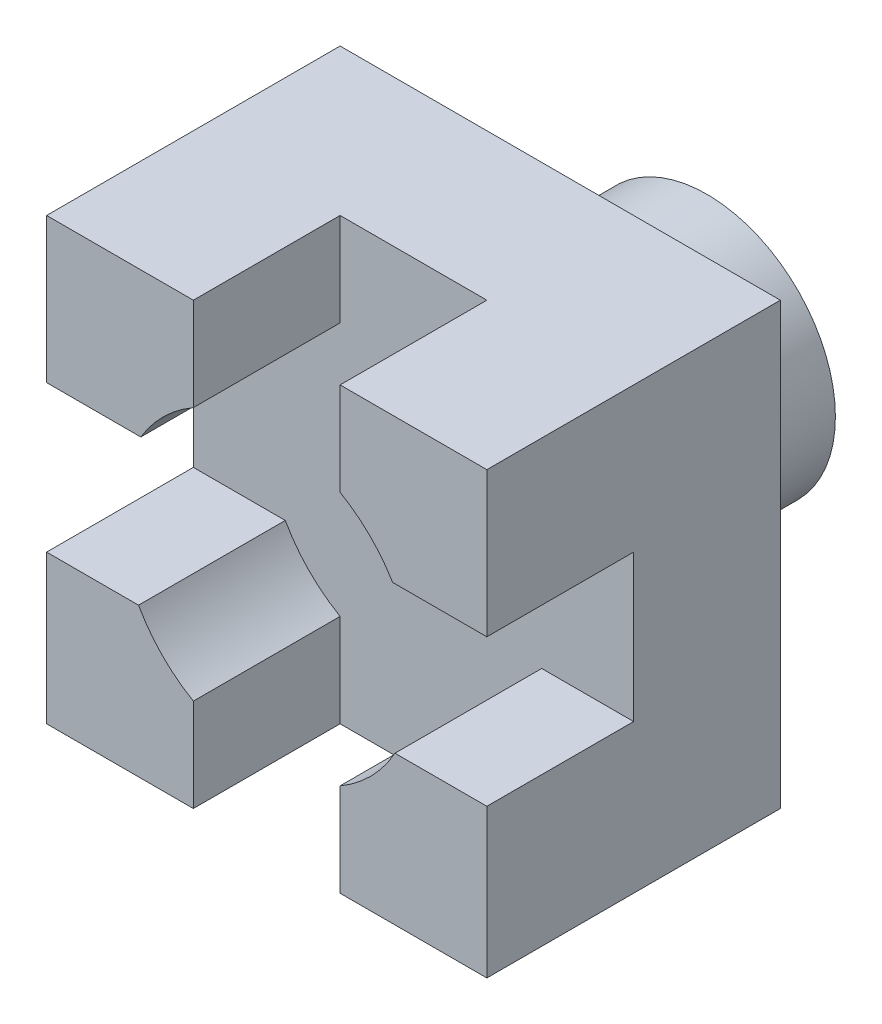
ISO-10303-21;
HEADER;
FILE_DESCRIPTION(('STEP AP214'),'2;1');
FILE_NAME('part.step','',(''),(''),'','','');
FILE_SCHEMA(('AUTOMOTIVE_DESIGN { 1 0 10303 214 1 1 1 1 }'));
ENDSEC;
DATA;
#1=APPLICATION_CONTEXT('core data for automotive mechanical design processes');
#2=APPLICATION_PROTOCOL_DEFINITION('international standard','automotive_design',2000,#1);
#3=PRODUCT_CONTEXT('',#1,'mechanical');
#4=PRODUCT('Part','Part','',(#3));
#5=PRODUCT_RELATED_PRODUCT_CATEGORY('part','',(#4));
#6=PRODUCT_DEFINITION_FORMATION('','',#4);
#7=PRODUCT_DEFINITION_CONTEXT('part definition',#1,'design');
#8=PRODUCT_DEFINITION('design','',#6,#7);
#9=PRODUCT_DEFINITION_SHAPE('','',#8);
#10=(LENGTH_UNIT() NAMED_UNIT(*) SI_UNIT(.MILLI.,.METRE.));
#11=(NAMED_UNIT(*) PLANE_ANGLE_UNIT() SI_UNIT($,.RADIAN.));
#12=(NAMED_UNIT(*) SI_UNIT($,.STERADIAN.) SOLID_ANGLE_UNIT());
#13=UNCERTAINTY_MEASURE_WITH_UNIT(LENGTH_MEASURE(1.E-05),#10,'distance_accuracy_value','');
#14=(GEOMETRIC_REPRESENTATION_CONTEXT(3) GLOBAL_UNCERTAINTY_ASSIGNED_CONTEXT((#13)) GLOBAL_UNIT_ASSIGNED_CONTEXT((#10,
#11,#12)) REPRESENTATION_CONTEXT('',''));
#15=CARTESIAN_POINT('',(0.,0.,0.));
#16=DIRECTION('',(0.,0.,1.));
#17=DIRECTION('',(1.,0.,0.));
#18=AXIS2_PLACEMENT_3D('',#15,#16,#17);
#19=CARTESIAN_POINT('',(-36.9678975337373,27.7914081400304,6.));
#20=DIRECTION('',(-1.,0.,0.));
#21=DIRECTION('',(0.,0.,1.));
#22=AXIS2_PLACEMENT_3D('',#19,#20,#21);
#23=PLANE('',#22);
#24=DIRECTION('',(0.,0.,1.));
#25=VECTOR('',#24,1.);
#26=CARTESIAN_POINT('',(-36.9678975337373,25.8182404913917,4.));
#27=LINE('',#26,#25);
#28=CARTESIAN_POINT('',(-36.9678975337373,25.8182404913917,4.));
#29=VERTEX_POINT('',#28);
#30=CARTESIAN_POINT('',(-36.9678975337373,25.8182404913917,6.));
#31=VERTEX_POINT('',#30);
#32=EDGE_CURVE('E287',#29,#31,#27,.T.);
#33=ORIENTED_EDGE('',*,*,#32,.F.);
#34=DIRECTION('',(0.,1.,0.));
#35=VECTOR('',#34,1.);
#36=CARTESIAN_POINT('',(-36.9678975337373,0.,4.));
#37=LINE('',#36,#35);
#38=CARTESIAN_POINT('',(-36.9678975337373,23.8182404913919,4.));
#39=VERTEX_POINT('',#38);
#40=EDGE_CURVE('E217',#39,#29,#37,.T.);
#41=ORIENTED_EDGE('',*,*,#40,.F.);
#42=DIRECTION('',(0.,0.,1.));
#43=VECTOR('',#42,1.);
#44=CARTESIAN_POINT('',(-36.9678975337373,23.8182404913919,4.));
#45=LINE('',#44,#43);
#46=CARTESIAN_POINT('',(-36.9678975337373,23.8182404913919,6.));
#47=VERTEX_POINT('',#46);
#48=EDGE_CURVE('E289',#39,#47,#45,.T.);
#49=ORIENTED_EDGE('',*,*,#48,.T.);
#50=DIRECTION('',(0.,1.,0.));
#51=VECTOR('',#50,1.);
#52=CARTESIAN_POINT('',(-36.9678975337373,27.7914081400304,6.));
#53=LINE('',#52,#51);
#54=CARTESIAN_POINT('',(-36.9678975337373,21.7914081400304,6.));
#55=VERTEX_POINT('',#54);
#56=EDGE_CURVE('E299',#55,#47,#53,.T.);
#57=ORIENTED_EDGE('',*,*,#56,.F.);
#58=DIRECTION('',(0.,0.,-1.));
#59=VECTOR('',#58,1.);
#60=CARTESIAN_POINT('',(-36.9678975337373,21.7914081400304,6.));
#61=LINE('',#60,#59);
#62=CARTESIAN_POINT('',(-36.9678975337373,21.7914081400304,2.));
#63=VERTEX_POINT('',#62);
#64=EDGE_CURVE('E311',#55,#63,#61,.T.);
#65=ORIENTED_EDGE('',*,*,#64,.T.);
#66=DIRECTION('',(0.,1.,0.));
#67=VECTOR('',#66,1.);
#68=CARTESIAN_POINT('',(-36.9678975337373,27.7914081400304,2.));
#69=LINE('',#68,#67);
#70=CARTESIAN_POINT('',(-36.9678975337373,27.7914081400304,2.));
#71=VERTEX_POINT('',#70);
#72=EDGE_CURVE('E268',#63,#71,#69,.T.);
#73=ORIENTED_EDGE('',*,*,#72,.T.);
#74=DIRECTION('',(0.,0.,-1.));
#75=VECTOR('',#74,1.);
#76=CARTESIAN_POINT('',(-36.9678975337373,27.7914081400304,6.));
#77=LINE('',#76,#75);
#78=CARTESIAN_POINT('',(-36.9678975337373,27.7914081400304,6.));
#79=VERTEX_POINT('',#78);
#80=EDGE_CURVE('E325',#79,#71,#77,.T.);
#81=ORIENTED_EDGE('',*,*,#80,.F.);
#82=EDGE_CURVE('E86',#31,#79,#53,.T.);
#83=ORIENTED_EDGE('',*,*,#82,.F.);
#84=EDGE_LOOP('',(#33,#41,#49,#57,#65,#73,#81,#83));
#85=FACE_BOUND('',#84,.T.);
#86=ADVANCED_FACE('F32',(#85),#23,.F.);
#87=CARTESIAN_POINT('',(-42.9678975337373,27.7914081400304,6.));
#88=DIRECTION('',(0.,-1.,0.));
#89=DIRECTION('',(0.,0.,-1.));
#90=AXIS2_PLACEMENT_3D('',#87,#88,#89);
#91=PLANE('',#90);
#92=DIRECTION('',(0.,0.,1.));
#93=VECTOR('',#92,1.);
#94=CARTESIAN_POINT('',(-40.9678975337373,27.7914081400304,4.));
#95=LINE('',#94,#93);
#96=CARTESIAN_POINT('',(-40.9678975337373,27.7914081400304,4.));
#97=VERTEX_POINT('',#96);
#98=CARTESIAN_POINT('',(-40.9678975337373,27.7914081400304,6.));
#99=VERTEX_POINT('',#98);
#100=EDGE_CURVE('E278',#97,#99,#95,.T.);
#101=ORIENTED_EDGE('',*,*,#100,.F.);
#102=DIRECTION('',(-1.,0.,0.));
#103=VECTOR('',#102,1.);
#104=CARTESIAN_POINT('',(0.,27.7914081400304,4.));
#105=LINE('',#104,#103);
#106=CARTESIAN_POINT('',(-38.9678975337373,27.7914081400304,4.));
#107=VERTEX_POINT('',#106);
#108=EDGE_CURVE('E228',#107,#97,#105,.T.);
#109=ORIENTED_EDGE('',*,*,#108,.F.);
#110=DIRECTION('',(0.,0.,1.));
#111=VECTOR('',#110,1.);
#112=CARTESIAN_POINT('',(-38.9678975337373,27.7914081400304,4.));
#113=LINE('',#112,#111);
#114=CARTESIAN_POINT('',(-38.9678975337373,27.7914081400304,6.));
#115=VERTEX_POINT('',#114);
#116=EDGE_CURVE('E280',#107,#115,#113,.T.);
#117=ORIENTED_EDGE('',*,*,#116,.T.);
#118=DIRECTION('',(-1.,0.,0.));
#119=VECTOR('',#118,1.);
#120=CARTESIAN_POINT('',(-42.9678975337373,27.7914081400304,6.));
#121=LINE('',#120,#119);
#122=EDGE_CURVE('E302',#79,#115,#121,.T.);
#123=ORIENTED_EDGE('',*,*,#122,.F.);
#124=ORIENTED_EDGE('',*,*,#80,.T.);
#125=DIRECTION('',(-1.,0.,0.));
#126=VECTOR('',#125,1.);
#127=CARTESIAN_POINT('',(-42.9678975337373,27.7914081400304,2.));
#128=LINE('',#127,#126);
#129=CARTESIAN_POINT('',(-42.9678975337373,27.7914081400304,2.));
#130=VERTEX_POINT('',#129);
#131=EDGE_CURVE('E314',#71,#130,#128,.T.);
#132=ORIENTED_EDGE('',*,*,#131,.T.);
#133=DIRECTION('',(0.,0.,-1.));
#134=VECTOR('',#133,1.);
#135=CARTESIAN_POINT('',(-42.9678975337373,27.7914081400304,6.));
#136=LINE('',#135,#134);
#137=CARTESIAN_POINT('',(-42.9678975337373,27.7914081400304,6.));
#138=VERTEX_POINT('',#137);
#139=EDGE_CURVE('E322',#138,#130,#136,.T.);
#140=ORIENTED_EDGE('',*,*,#139,.F.);
#141=EDGE_CURVE('E301',#99,#138,#121,.T.);
#142=ORIENTED_EDGE('',*,*,#141,.F.);
#143=EDGE_LOOP('',(#101,#109,#117,#123,#124,#132,#140,#142));
#144=FACE_BOUND('',#143,.T.);
#145=ADVANCED_FACE('F354',(#144),#91,.F.);
#146=CARTESIAN_POINT('',(-42.9678975337373,27.7914081400304,6.));
#147=DIRECTION('',(1.,0.,0.));
#148=DIRECTION('',(0.,0.,-1.));
#149=AXIS2_PLACEMENT_3D('',#146,#147,#148);
#150=PLANE('',#149);
#151=DIRECTION('',(0.,0.,1.));
#152=VECTOR('',#151,1.);
#153=CARTESIAN_POINT('',(-42.9678975337373,23.8182404913919,4.));
#154=LINE('',#153,#152);
#155=CARTESIAN_POINT('',(-42.9678975337373,23.8182404913919,4.));
#156=VERTEX_POINT('',#155);
#157=CARTESIAN_POINT('',(-42.9678975337373,23.8182404913919,6.));
#158=VERTEX_POINT('',#157);
#159=EDGE_CURVE('E269',#156,#158,#154,.T.);
#160=ORIENTED_EDGE('',*,*,#159,.F.);
#161=DIRECTION('',(0.,-1.,0.));
#162=VECTOR('',#161,1.);
#163=CARTESIAN_POINT('',(-42.9678975337373,0.,4.));
#164=LINE('',#163,#162);
#165=CARTESIAN_POINT('',(-42.9678975337373,25.8182404913917,4.));
#166=VERTEX_POINT('',#165);
#167=EDGE_CURVE('E238',#166,#156,#164,.T.);
#168=ORIENTED_EDGE('',*,*,#167,.F.);
#169=DIRECTION('',(0.,0.,1.));
#170=VECTOR('',#169,1.);
#171=CARTESIAN_POINT('',(-42.9678975337373,25.8182404913917,4.));
#172=LINE('',#171,#170);
#173=CARTESIAN_POINT('',(-42.9678975337373,25.8182404913917,6.));
#174=VERTEX_POINT('',#173);
#175=EDGE_CURVE('E271',#166,#174,#172,.T.);
#176=ORIENTED_EDGE('',*,*,#175,.T.);
#177=DIRECTION('',(0.,-1.,0.));
#178=VECTOR('',#177,1.);
#179=CARTESIAN_POINT('',(-42.9678975337373,27.7914081400304,6.));
#180=LINE('',#179,#178);
#181=EDGE_CURVE('E305',#138,#174,#180,.T.);
#182=ORIENTED_EDGE('',*,*,#181,.F.);
#183=ORIENTED_EDGE('',*,*,#139,.T.);
#184=DIRECTION('',(0.,-1.,0.));
#185=VECTOR('',#184,1.);
#186=CARTESIAN_POINT('',(-42.9678975337373,27.7914081400304,2.));
#187=LINE('',#186,#185);
#188=CARTESIAN_POINT('',(-42.9678975337373,21.7914081400304,2.));
#189=VERTEX_POINT('',#188);
#190=EDGE_CURVE('E316',#130,#189,#187,.T.);
#191=ORIENTED_EDGE('',*,*,#190,.T.);
#192=DIRECTION('',(0.,0.,-1.));
#193=VECTOR('',#192,1.);
#194=CARTESIAN_POINT('',(-42.9678975337373,21.7914081400304,6.));
#195=LINE('',#194,#193);
#196=CARTESIAN_POINT('',(-42.9678975337373,21.7914081400304,6.));
#197=VERTEX_POINT('',#196);
#198=EDGE_CURVE('E320',#197,#189,#195,.T.);
#199=ORIENTED_EDGE('',*,*,#198,.F.);
#200=EDGE_CURVE('E304',#158,#197,#180,.T.);
#201=ORIENTED_EDGE('',*,*,#200,.F.);
#202=EDGE_LOOP('',(#160,#168,#176,#182,#183,#191,#199,#201));
#203=FACE_BOUND('',#202,.T.);
#204=ADVANCED_FACE('F360',(#203),#150,.F.);
#205=CARTESIAN_POINT('',(-42.9678975337373,21.7914081400304,6.));
#206=DIRECTION('',(0.,1.,0.));
#207=DIRECTION('',(0.,0.,1.));
#208=AXIS2_PLACEMENT_3D('',#205,#206,#207);
#209=PLANE('',#208);
#210=DIRECTION('',(0.,0.,1.));
#211=VECTOR('',#210,1.);
#212=CARTESIAN_POINT('',(-38.9678975337373,21.7914081400304,4.));
#213=LINE('',#212,#211);
#214=CARTESIAN_POINT('',(-38.9678975337373,21.7914081400304,4.));
#215=VERTEX_POINT('',#214);
#216=CARTESIAN_POINT('',(-38.9678975337373,21.7914081400304,6.));
#217=VERTEX_POINT('',#216);
#218=EDGE_CURVE('E296',#215,#217,#213,.T.);
#219=ORIENTED_EDGE('',*,*,#218,.F.);
#220=DIRECTION('',(1.,0.,0.));
#221=VECTOR('',#220,1.);
#222=CARTESIAN_POINT('',(0.,21.7914081400304,4.));
#223=LINE('',#222,#221);
#224=CARTESIAN_POINT('',(-40.9678975337373,21.7914081400304,4.));
#225=VERTEX_POINT('',#224);
#226=EDGE_CURVE('E192',#225,#215,#223,.T.);
#227=ORIENTED_EDGE('',*,*,#226,.F.);
#228=DIRECTION('',(0.,0.,1.));
#229=VECTOR('',#228,1.);
#230=CARTESIAN_POINT('',(-40.9678975337373,21.7914081400304,4.));
#231=LINE('',#230,#229);
#232=CARTESIAN_POINT('',(-40.9678975337373,21.7914081400304,6.));
#233=VERTEX_POINT('',#232);
#234=EDGE_CURVE('E187',#225,#233,#231,.T.);
#235=ORIENTED_EDGE('',*,*,#234,.T.);
#236=DIRECTION('',(1.,0.,0.));
#237=VECTOR('',#236,1.);
#238=CARTESIAN_POINT('',(-42.9678975337373,21.7914081400304,6.));
#239=LINE('',#238,#237);
#240=EDGE_CURVE('E308',#197,#233,#239,.T.);
#241=ORIENTED_EDGE('',*,*,#240,.F.);
#242=ORIENTED_EDGE('',*,*,#198,.T.);
#243=DIRECTION('',(1.,0.,0.));
#244=VECTOR('',#243,1.);
#245=CARTESIAN_POINT('',(-42.9678975337373,21.7914081400304,2.));
#246=LINE('',#245,#244);
#247=EDGE_CURVE('E78',#189,#63,#246,.T.);
#248=ORIENTED_EDGE('',*,*,#247,.T.);
#249=ORIENTED_EDGE('',*,*,#64,.F.);
#250=EDGE_CURVE('E56',#217,#55,#239,.T.);
#251=ORIENTED_EDGE('',*,*,#250,.F.);
#252=EDGE_LOOP('',(#219,#227,#235,#241,#242,#248,#249,#251));
#253=FACE_BOUND('',#252,.T.);
#254=ADVANCED_FACE('F395',(#253),#209,.F.);
#255=CARTESIAN_POINT('',(0.,0.,6.));
#256=DIRECTION('',(0.,0.,1.));
#257=DIRECTION('',(1.,0.,0.));
#258=AXIS2_PLACEMENT_3D('',#255,#256,#257);
#259=PLANE('',#258);
#260=ORIENTED_EDGE('',*,*,#181,.T.);
#261=DIRECTION('',(1.,0.,0.));
#262=VECTOR('',#261,1.);
#263=CARTESIAN_POINT('',(0.,25.8182404913917,6.));
#264=LINE('',#263,#262);
#265=CARTESIAN_POINT('',(-41.6841770337599,25.8182404913917,6.));
#266=VERTEX_POINT('',#265);
#267=EDGE_CURVE('E205',#174,#266,#264,.T.);
#268=ORIENTED_EDGE('',*,*,#267,.T.);
#269=CARTESIAN_POINT('',(-39.9678975337373,24.7914081400304,6.));
#270=DIRECTION('',(0.,0.,1.));
#271=DIRECTION('',(1.,0.,0.));
#272=AXIS2_PLACEMENT_3D('',#269,#270,#271);
#273=CIRCLE('',#272,2.);
#274=CARTESIAN_POINT('',(-40.9678975337373,26.5234589475993,6.));
#275=VERTEX_POINT('',#274);
#276=EDGE_CURVE('E261',#275,#266,#273,.T.);
#277=ORIENTED_EDGE('',*,*,#276,.F.);
#278=DIRECTION('',(0.,1.,0.));
#279=VECTOR('',#278,1.);
#280=CARTESIAN_POINT('',(-40.9678975337373,0.,6.));
#281=LINE('',#280,#279);
#282=EDGE_CURVE('E258',#275,#99,#281,.T.);
#283=ORIENTED_EDGE('',*,*,#282,.T.);
#284=ORIENTED_EDGE('',*,*,#141,.T.);
#285=EDGE_LOOP('',(#260,#268,#277,#283,#284));
#286=FACE_BOUND('',#285,.T.);
#287=ADVANCED_FACE('F379',(#286),#259,.T.);
#288=DIRECTION('',(0.,1.,0.));
#289=VECTOR('',#288,1.);
#290=CARTESIAN_POINT('',(-38.9678975337373,0.,6.));
#291=LINE('',#290,#289);
#292=CARTESIAN_POINT('',(-38.9678975337373,26.5234589475993,6.));
#293=VERTEX_POINT('',#292);
#294=EDGE_CURVE('E256',#293,#115,#291,.T.);
#295=ORIENTED_EDGE('',*,*,#294,.F.);
#296=CARTESIAN_POINT('',(-39.9678975337373,24.7914081400304,6.));
#297=DIRECTION('',(0.,0.,1.));
#298=DIRECTION('',(1.,0.,0.));
#299=AXIS2_PLACEMENT_3D('',#296,#297,#298);
#300=CIRCLE('',#299,2.);
#301=CARTESIAN_POINT('',(-38.2516180337147,25.8182404913917,6.));
#302=VERTEX_POINT('',#301);
#303=EDGE_CURVE('E253',#302,#293,#300,.T.);
#304=ORIENTED_EDGE('',*,*,#303,.F.);
#305=DIRECTION('',(1.,0.,0.));
#306=VECTOR('',#305,1.);
#307=CARTESIAN_POINT('',(0.,25.8182404913917,6.));
#308=LINE('',#307,#306);
#309=EDGE_CURVE('E251',#302,#31,#308,.T.);
#310=ORIENTED_EDGE('',*,*,#309,.T.);
#311=ORIENTED_EDGE('',*,*,#82,.T.);
#312=ORIENTED_EDGE('',*,*,#122,.T.);
#313=EDGE_LOOP('',(#295,#304,#310,#311,#312));
#314=FACE_BOUND('',#313,.T.);
#315=ADVANCED_FACE('F348',(#314),#259,.T.);
#316=CARTESIAN_POINT('',(-39.9678975337373,24.7914081400304,6.));
#317=DIRECTION('',(0.,0.,1.));
#318=DIRECTION('',(1.,0.,0.));
#319=AXIS2_PLACEMENT_3D('',#316,#317,#318);
#320=CIRCLE('',#319,2.);
#321=CARTESIAN_POINT('',(-41.7151653230711,23.8182404913919,6.));
#322=VERTEX_POINT('',#321);
#323=CARTESIAN_POINT('',(-40.9678975337373,23.0593573324616,6.));
#324=VERTEX_POINT('',#323);
#325=EDGE_CURVE('E47',#322,#324,#320,.T.);
#326=ORIENTED_EDGE('',*,*,#325,.F.);
#327=DIRECTION('',(-1.,0.,0.));
#328=VECTOR('',#327,1.);
#329=CARTESIAN_POINT('',(0.,23.8182404913919,6.));
#330=LINE('',#329,#328);
#331=EDGE_CURVE('E202',#322,#158,#330,.T.);
#332=ORIENTED_EDGE('',*,*,#331,.T.);
#333=ORIENTED_EDGE('',*,*,#200,.T.);
#334=ORIENTED_EDGE('',*,*,#240,.T.);
#335=DIRECTION('',(0.,1.,0.));
#336=VECTOR('',#335,1.);
#337=CARTESIAN_POINT('',(-40.9678975337373,0.,6.));
#338=LINE('',#337,#336);
#339=EDGE_CURVE('E242',#233,#324,#338,.T.);
#340=ORIENTED_EDGE('',*,*,#339,.T.);
#341=EDGE_LOOP('',(#326,#332,#333,#334,#340));
#342=FACE_BOUND('',#341,.T.);
#343=ADVANCED_FACE('F341',(#342),#259,.T.);
#344=CARTESIAN_POINT('',(-39.9678975337373,24.7914081400304,0.));
#345=DIRECTION('',(0.,0.,1.));
#346=DIRECTION('',(1.,0.,0.));
#347=AXIS2_PLACEMENT_3D('',#344,#345,#346);
#348=PLANE('',#347);
#349=CARTESIAN_POINT('',(-39.9678975337373,24.7914081400304,0.));
#350=DIRECTION('',(0.,0.,1.));
#351=DIRECTION('',(1.,0.,0.));
#352=AXIS2_PLACEMENT_3D('',#349,#350,#351);
#353=CIRCLE('',#352,1.75);
#354=CARTESIAN_POINT('',(-38.2178975337373,24.7914081400304,0.));
#355=VERTEX_POINT('',#354);
#356=EDGE_CURVE('E36',#355,#355,#353,.T.);
#357=ORIENTED_EDGE('',*,*,#356,.F.);
#358=EDGE_LOOP('',(#357));
#359=FACE_BOUND('',#358,.T.);
#360=CARTESIAN_POINT('',(-39.9678975337373,24.7914081400304,0.));
#361=DIRECTION('',(0.,0.,1.));
#362=DIRECTION('',(1.,0.,0.));
#363=AXIS2_PLACEMENT_3D('',#360,#361,#362);
#364=CIRCLE('',#363,0.999999999999998);
#365=CARTESIAN_POINT('',(-38.9678975337373,24.7914081400304,0.));
#366=VERTEX_POINT('',#365);
#367=EDGE_CURVE('E331',#366,#366,#364,.T.);
#368=ORIENTED_EDGE('',*,*,#367,.T.);
#369=EDGE_LOOP('',(#368));
#370=FACE_BOUND('',#369,.T.);
#371=ADVANCED_FACE('F339',(#359,#370),#348,.F.);
#372=CARTESIAN_POINT('',(-39.9678975337373,24.7914081400304,2.));
#373=DIRECTION('',(0.,0.,-1.));
#374=DIRECTION('',(-1.,0.,0.));
#375=AXIS2_PLACEMENT_3D('',#372,#373,#374);
#376=CYLINDRICAL_SURFACE('',#375,1.75);
#377=CARTESIAN_POINT('',(-39.9678975337373,24.7914081400304,2.));
#378=DIRECTION('',(0.,0.,1.));
#379=DIRECTION('',(1.,0.,0.));
#380=AXIS2_PLACEMENT_3D('',#377,#378,#379);
#381=CIRCLE('',#380,1.75);
#382=CARTESIAN_POINT('',(-38.2178975337373,24.7914081400304,2.));
#383=VERTEX_POINT('',#382);
#384=EDGE_CURVE('E11',#383,#383,#381,.T.);
#385=ORIENTED_EDGE('',*,*,#384,.F.);
#386=EDGE_LOOP('',(#385));
#387=FACE_BOUND('',#386,.T.);
#388=ORIENTED_EDGE('',*,*,#356,.T.);
#389=EDGE_LOOP('',(#388));
#390=FACE_BOUND('',#389,.T.);
#391=ADVANCED_FACE('F34',(#387,#390),#376,.T.);
#392=CARTESIAN_POINT('',(-39.9678975337373,24.7914081400304,2.));
#393=DIRECTION('',(0.,0.,-1.));
#394=DIRECTION('',(-1.,0.,0.));
#395=AXIS2_PLACEMENT_3D('',#392,#393,#394);
#396=CYLINDRICAL_SURFACE('',#395,0.999999999999998);
#397=CARTESIAN_POINT('',(-39.9678975337373,24.7914081400304,2.));
#398=DIRECTION('',(0.,0.,1.));
#399=DIRECTION('',(1.,0.,0.));
#400=AXIS2_PLACEMENT_3D('',#397,#398,#399);
#401=CIRCLE('',#400,0.999999999999998);
#402=CARTESIAN_POINT('',(-38.9678975337373,24.7914081400304,2.));
#403=VERTEX_POINT('',#402);
#404=EDGE_CURVE('E328',#403,#403,#401,.T.);
#405=ORIENTED_EDGE('',*,*,#404,.T.);
#406=EDGE_LOOP('',(#405));
#407=FACE_BOUND('',#406,.T.);
#408=ORIENTED_EDGE('',*,*,#367,.F.);
#409=EDGE_LOOP('',(#408));
#410=FACE_BOUND('',#409,.T.);
#411=ADVANCED_FACE('F346',(#407,#410),#396,.F.);
#412=CARTESIAN_POINT('',(0.,0.,2.));
#413=DIRECTION('',(0.,0.,1.));
#414=DIRECTION('',(1.,0.,0.));
#415=AXIS2_PLACEMENT_3D('',#412,#413,#414);
#416=PLANE('',#415);
#417=ORIENTED_EDGE('',*,*,#404,.F.);
#418=EDGE_LOOP('',(#417));
#419=FACE_BOUND('',#418,.T.);
#420=ADVANCED_FACE('F366',(#419),#416,.F.);
#421=DIRECTION('',(1.,0.,0.));
#422=VECTOR('',#421,1.);
#423=CARTESIAN_POINT('',(0.,23.8182404913919,6.));
#424=LINE('',#423,#422);
#425=CARTESIAN_POINT('',(-38.2206297444035,23.8182404913919,6.));
#426=VERTEX_POINT('',#425);
#427=EDGE_CURVE('E249',#426,#47,#424,.T.);
#428=ORIENTED_EDGE('',*,*,#427,.F.);
#429=CARTESIAN_POINT('',(-39.9678975337373,24.7914081400304,6.));
#430=DIRECTION('',(0.,0.,1.));
#431=DIRECTION('',(1.,0.,0.));
#432=AXIS2_PLACEMENT_3D('',#429,#430,#431);
#433=CIRCLE('',#432,2.);
#434=CARTESIAN_POINT('',(-38.9678975337373,23.0593573324616,6.));
#435=VERTEX_POINT('',#434);
#436=EDGE_CURVE('E246',#435,#426,#433,.T.);
#437=ORIENTED_EDGE('',*,*,#436,.F.);
#438=DIRECTION('',(0.,-1.,0.));
#439=VECTOR('',#438,1.);
#440=CARTESIAN_POINT('',(-38.9678975337373,0.,6.));
#441=LINE('',#440,#439);
#442=EDGE_CURVE('E244',#435,#217,#441,.T.);
#443=ORIENTED_EDGE('',*,*,#442,.T.);
#444=ORIENTED_EDGE('',*,*,#250,.T.);
#445=ORIENTED_EDGE('',*,*,#56,.T.);
#446=EDGE_LOOP('',(#428,#437,#443,#444,#445));
#447=FACE_BOUND('',#446,.T.);
#448=ADVANCED_FACE('F351',(#447),#259,.T.);
#449=ORIENTED_EDGE('',*,*,#384,.T.);
#450=EDGE_LOOP('',(#449));
#451=FACE_BOUND('',#450,.T.);
#452=ORIENTED_EDGE('',*,*,#72,.F.);
#453=ORIENTED_EDGE('',*,*,#247,.F.);
#454=ORIENTED_EDGE('',*,*,#190,.F.);
#455=ORIENTED_EDGE('',*,*,#131,.F.);
#456=EDGE_LOOP('',(#452,#453,#454,#455));
#457=FACE_BOUND('',#456,.T.);
#458=ADVANCED_FACE('F373',(#451,#457),#416,.F.);
#459=CARTESIAN_POINT('',(-39.9678975337373,24.7914081400304,4.));
#460=DIRECTION('',(0.,0.,1.));
#461=DIRECTION('',(1.,0.,0.));
#462=AXIS2_PLACEMENT_3D('',#459,#460,#461);
#463=CYLINDRICAL_SURFACE('',#462,2.);
#464=ORIENTED_EDGE('',*,*,#325,.T.);
#465=DIRECTION('',(0.,0.,1.));
#466=VECTOR('',#465,1.);
#467=CARTESIAN_POINT('',(-40.9678975337373,23.0593573324616,4.));
#468=LINE('',#467,#466);
#469=CARTESIAN_POINT('',(-40.9678975337373,23.0593573324616,4.));
#470=VERTEX_POINT('',#469);
#471=EDGE_CURVE('E184',#470,#324,#468,.T.);
#472=ORIENTED_EDGE('',*,*,#471,.F.);
#473=CARTESIAN_POINT('',(-39.9678975337373,24.7914081400304,4.));
#474=DIRECTION('',(0.,0.,1.));
#475=DIRECTION('',(1.,0.,0.));
#476=AXIS2_PLACEMENT_3D('',#473,#474,#475);
#477=CIRCLE('',#476,2.);
#478=CARTESIAN_POINT('',(-41.7151653230711,23.8182404913919,4.));
#479=VERTEX_POINT('',#478);
#480=EDGE_CURVE('E193',#479,#470,#477,.T.);
#481=ORIENTED_EDGE('',*,*,#480,.F.);
#482=DIRECTION('',(0.,0.,1.));
#483=VECTOR('',#482,1.);
#484=CARTESIAN_POINT('',(-41.7151653230711,23.8182404913919,4.));
#485=LINE('',#484,#483);
#486=EDGE_CURVE('E266',#479,#322,#485,.T.);
#487=ORIENTED_EDGE('',*,*,#486,.T.);
#488=EDGE_LOOP('',(#464,#472,#481,#487));
#489=FACE_BOUND('',#488,.T.);
#490=ADVANCED_FACE('F196',(#489),#463,.F.);
#491=CARTESIAN_POINT('',(0.,23.8182404913919,4.));
#492=DIRECTION('',(0.,1.,0.));
#493=DIRECTION('',(0.,0.,1.));
#494=AXIS2_PLACEMENT_3D('',#491,#492,#493);
#495=PLANE('',#494);
#496=ORIENTED_EDGE('',*,*,#331,.F.);
#497=ORIENTED_EDGE('',*,*,#486,.F.);
#498=DIRECTION('',(-1.,0.,0.));
#499=VECTOR('',#498,1.);
#500=CARTESIAN_POINT('',(0.,23.8182404913919,4.));
#501=LINE('',#500,#499);
#502=EDGE_CURVE('E197',#479,#156,#501,.T.);
#503=ORIENTED_EDGE('',*,*,#502,.T.);
#504=ORIENTED_EDGE('',*,*,#159,.T.);
#505=EDGE_LOOP('',(#496,#497,#503,#504));
#506=FACE_BOUND('',#505,.T.);
#507=ADVANCED_FACE('F386',(#506),#495,.T.);
#508=CARTESIAN_POINT('',(0.,25.8182404913917,4.));
#509=DIRECTION('',(0.,-1.,0.));
#510=DIRECTION('',(0.,0.,-1.));
#511=AXIS2_PLACEMENT_3D('',#508,#509,#510);
#512=PLANE('',#511);
#513=ORIENTED_EDGE('',*,*,#267,.F.);
#514=ORIENTED_EDGE('',*,*,#175,.F.);
#515=DIRECTION('',(1.,0.,0.));
#516=VECTOR('',#515,1.);
#517=CARTESIAN_POINT('',(0.,25.8182404913917,4.));
#518=LINE('',#517,#516);
#519=CARTESIAN_POINT('',(-41.6841770337599,25.8182404913917,4.));
#520=VERTEX_POINT('',#519);
#521=EDGE_CURVE('E236',#166,#520,#518,.T.);
#522=ORIENTED_EDGE('',*,*,#521,.T.);
#523=DIRECTION('',(0.,0.,1.));
#524=VECTOR('',#523,1.);
#525=CARTESIAN_POINT('',(-41.6841770337599,25.8182404913917,4.));
#526=LINE('',#525,#524);
#527=EDGE_CURVE('E274',#520,#266,#526,.T.);
#528=ORIENTED_EDGE('',*,*,#527,.T.);
#529=EDGE_LOOP('',(#513,#514,#522,#528));
#530=FACE_BOUND('',#529,.T.);
#531=ADVANCED_FACE('F445',(#530),#512,.T.);
#532=CARTESIAN_POINT('',(-39.9678975337373,24.7914081400304,4.));
#533=DIRECTION('',(0.,0.,1.));
#534=DIRECTION('',(1.,0.,0.));
#535=AXIS2_PLACEMENT_3D('',#532,#533,#534);
#536=CYLINDRICAL_SURFACE('',#535,2.);
#537=ORIENTED_EDGE('',*,*,#276,.T.);
#538=ORIENTED_EDGE('',*,*,#527,.F.);
#539=CARTESIAN_POINT('',(-39.9678975337373,24.7914081400304,4.));
#540=DIRECTION('',(0.,0.,1.));
#541=DIRECTION('',(1.,0.,0.));
#542=AXIS2_PLACEMENT_3D('',#539,#540,#541);
#543=CIRCLE('',#542,2.);
#544=CARTESIAN_POINT('',(-40.9678975337373,26.5234589475993,4.));
#545=VERTEX_POINT('',#544);
#546=EDGE_CURVE('E233',#545,#520,#543,.T.);
#547=ORIENTED_EDGE('',*,*,#546,.F.);
#548=DIRECTION('',(0.,0.,1.));
#549=VECTOR('',#548,1.);
#550=CARTESIAN_POINT('',(-40.9678975337373,26.5234589475993,4.));
#551=LINE('',#550,#549);
#552=EDGE_CURVE('E276',#545,#275,#551,.T.);
#553=ORIENTED_EDGE('',*,*,#552,.T.);
#554=EDGE_LOOP('',(#537,#538,#547,#553));
#555=FACE_BOUND('',#554,.T.);
#556=ADVANCED_FACE('F431',(#555),#536,.F.);
#557=CARTESIAN_POINT('',(-40.9678975337373,0.,4.));
#558=DIRECTION('',(1.,0.,0.));
#559=DIRECTION('',(0.,0.,-1.));
#560=AXIS2_PLACEMENT_3D('',#557,#558,#559);
#561=PLANE('',#560);
#562=ORIENTED_EDGE('',*,*,#282,.F.);
#563=ORIENTED_EDGE('',*,*,#552,.F.);
#564=DIRECTION('',(0.,1.,0.));
#565=VECTOR('',#564,1.);
#566=CARTESIAN_POINT('',(-40.9678975337373,0.,4.));
#567=LINE('',#566,#565);
#568=EDGE_CURVE('E231',#545,#97,#567,.T.);
#569=ORIENTED_EDGE('',*,*,#568,.T.);
#570=ORIENTED_EDGE('',*,*,#100,.T.);
#571=EDGE_LOOP('',(#562,#563,#569,#570));
#572=FACE_BOUND('',#571,.T.);
#573=ADVANCED_FACE('F426',(#572),#561,.T.);
#574=CARTESIAN_POINT('',(-38.9678975337373,0.,4.));
#575=DIRECTION('',(1.,0.,0.));
#576=DIRECTION('',(0.,0.,-1.));
#577=AXIS2_PLACEMENT_3D('',#574,#575,#576);
#578=PLANE('',#577);
#579=ORIENTED_EDGE('',*,*,#294,.T.);
#580=ORIENTED_EDGE('',*,*,#116,.F.);
#581=DIRECTION('',(0.,1.,0.));
#582=VECTOR('',#581,1.);
#583=CARTESIAN_POINT('',(-38.9678975337373,0.,4.));
#584=LINE('',#583,#582);
#585=CARTESIAN_POINT('',(-38.9678975337373,26.5234589475993,4.));
#586=VERTEX_POINT('',#585);
#587=EDGE_CURVE('E225',#586,#107,#584,.T.);
#588=ORIENTED_EDGE('',*,*,#587,.F.);
#589=DIRECTION('',(0.,0.,1.));
#590=VECTOR('',#589,1.);
#591=CARTESIAN_POINT('',(-38.9678975337373,26.5234589475993,4.));
#592=LINE('',#591,#590);
#593=EDGE_CURVE('E283',#586,#293,#592,.T.);
#594=ORIENTED_EDGE('',*,*,#593,.T.);
#595=EDGE_LOOP('',(#579,#580,#588,#594));
#596=FACE_BOUND('',#595,.T.);
#597=ADVANCED_FACE('F457',(#596),#578,.F.);
#598=CARTESIAN_POINT('',(-39.9678975337373,24.7914081400304,4.));
#599=DIRECTION('',(0.,0.,1.));
#600=DIRECTION('',(1.,0.,0.));
#601=AXIS2_PLACEMENT_3D('',#598,#599,#600);
#602=CYLINDRICAL_SURFACE('',#601,2.);
#603=ORIENTED_EDGE('',*,*,#303,.T.);
#604=ORIENTED_EDGE('',*,*,#593,.F.);
#605=CARTESIAN_POINT('',(-39.9678975337373,24.7914081400304,4.));
#606=DIRECTION('',(0.,0.,1.));
#607=DIRECTION('',(1.,0.,0.));
#608=AXIS2_PLACEMENT_3D('',#605,#606,#607);
#609=CIRCLE('',#608,2.);
#610=CARTESIAN_POINT('',(-38.2516180337147,25.8182404913917,4.));
#611=VERTEX_POINT('',#610);
#612=EDGE_CURVE('E222',#611,#586,#609,.T.);
#613=ORIENTED_EDGE('',*,*,#612,.F.);
#614=DIRECTION('',(0.,0.,1.));
#615=VECTOR('',#614,1.);
#616=CARTESIAN_POINT('',(-38.2516180337147,25.8182404913917,4.));
#617=LINE('',#616,#615);
#618=EDGE_CURVE('E285',#611,#302,#617,.T.);
#619=ORIENTED_EDGE('',*,*,#618,.T.);
#620=EDGE_LOOP('',(#603,#604,#613,#619));
#621=FACE_BOUND('',#620,.T.);
#622=ADVANCED_FACE('F415',(#621),#602,.F.);
#623=CARTESIAN_POINT('',(0.,25.8182404913917,4.));
#624=DIRECTION('',(0.,-1.,0.));
#625=DIRECTION('',(0.,0.,-1.));
#626=AXIS2_PLACEMENT_3D('',#623,#624,#625);
#627=PLANE('',#626);
#628=ORIENTED_EDGE('',*,*,#309,.F.);
#629=ORIENTED_EDGE('',*,*,#618,.F.);
#630=DIRECTION('',(1.,0.,0.));
#631=VECTOR('',#630,1.);
#632=CARTESIAN_POINT('',(0.,25.8182404913917,4.));
#633=LINE('',#632,#631);
#634=EDGE_CURVE('E220',#611,#29,#633,.T.);
#635=ORIENTED_EDGE('',*,*,#634,.T.);
#636=ORIENTED_EDGE('',*,*,#32,.T.);
#637=EDGE_LOOP('',(#628,#629,#635,#636));
#638=FACE_BOUND('',#637,.T.);
#639=ADVANCED_FACE('F411',(#638),#627,.T.);
#640=CARTESIAN_POINT('',(0.,23.8182404913919,4.));
#641=DIRECTION('',(0.,-1.,0.));
#642=DIRECTION('',(0.,0.,-1.));
#643=AXIS2_PLACEMENT_3D('',#640,#641,#642);
#644=PLANE('',#643);
#645=ORIENTED_EDGE('',*,*,#427,.T.);
#646=ORIENTED_EDGE('',*,*,#48,.F.);
#647=DIRECTION('',(1.,0.,0.));
#648=VECTOR('',#647,1.);
#649=CARTESIAN_POINT('',(0.,23.8182404913919,4.));
#650=LINE('',#649,#648);
#651=CARTESIAN_POINT('',(-38.2206297444035,23.8182404913919,4.));
#652=VERTEX_POINT('',#651);
#653=EDGE_CURVE('E214',#652,#39,#650,.T.);
#654=ORIENTED_EDGE('',*,*,#653,.F.);
#655=DIRECTION('',(0.,0.,1.));
#656=VECTOR('',#655,1.);
#657=CARTESIAN_POINT('',(-38.2206297444035,23.8182404913919,4.));
#658=LINE('',#657,#656);
#659=EDGE_CURVE('E292',#652,#426,#658,.T.);
#660=ORIENTED_EDGE('',*,*,#659,.T.);
#661=EDGE_LOOP('',(#645,#646,#654,#660));
#662=FACE_BOUND('',#661,.T.);
#663=ADVANCED_FACE('F464',(#662),#644,.F.);
#664=CARTESIAN_POINT('',(-39.9678975337373,24.7914081400304,4.));
#665=DIRECTION('',(0.,0.,1.));
#666=DIRECTION('',(1.,0.,0.));
#667=AXIS2_PLACEMENT_3D('',#664,#665,#666);
#668=CYLINDRICAL_SURFACE('',#667,2.);
#669=ORIENTED_EDGE('',*,*,#436,.T.);
#670=ORIENTED_EDGE('',*,*,#659,.F.);
#671=CARTESIAN_POINT('',(-39.9678975337373,24.7914081400304,4.));
#672=DIRECTION('',(0.,0.,1.));
#673=DIRECTION('',(1.,0.,0.));
#674=AXIS2_PLACEMENT_3D('',#671,#672,#673);
#675=CIRCLE('',#674,2.);
#676=CARTESIAN_POINT('',(-38.9678975337373,23.0593573324616,4.));
#677=VERTEX_POINT('',#676);
#678=EDGE_CURVE('E211',#677,#652,#675,.T.);
#679=ORIENTED_EDGE('',*,*,#678,.F.);
#680=DIRECTION('',(0.,0.,1.));
#681=VECTOR('',#680,1.);
#682=CARTESIAN_POINT('',(-38.9678975337373,23.0593573324616,4.));
#683=LINE('',#682,#681);
#684=EDGE_CURVE('E294',#677,#435,#683,.T.);
#685=ORIENTED_EDGE('',*,*,#684,.T.);
#686=EDGE_LOOP('',(#669,#670,#679,#685));
#687=FACE_BOUND('',#686,.T.);
#688=ADVANCED_FACE('F403',(#687),#668,.F.);
#689=CARTESIAN_POINT('',(-38.9678975337373,0.,4.));
#690=DIRECTION('',(-1.,0.,0.));
#691=DIRECTION('',(0.,0.,1.));
#692=AXIS2_PLACEMENT_3D('',#689,#690,#691);
#693=PLANE('',#692);
#694=ORIENTED_EDGE('',*,*,#442,.F.);
#695=ORIENTED_EDGE('',*,*,#684,.F.);
#696=DIRECTION('',(0.,-1.,0.));
#697=VECTOR('',#696,1.);
#698=CARTESIAN_POINT('',(-38.9678975337373,0.,4.));
#699=LINE('',#698,#697);
#700=EDGE_CURVE('E209',#677,#215,#699,.T.);
#701=ORIENTED_EDGE('',*,*,#700,.T.);
#702=ORIENTED_EDGE('',*,*,#218,.T.);
#703=EDGE_LOOP('',(#694,#695,#701,#702));
#704=FACE_BOUND('',#703,.T.);
#705=ADVANCED_FACE('F398',(#704),#693,.T.);
#706=CARTESIAN_POINT('',(-40.9678975337373,0.,4.));
#707=DIRECTION('',(1.,0.,0.));
#708=DIRECTION('',(0.,0.,-1.));
#709=AXIS2_PLACEMENT_3D('',#706,#707,#708);
#710=PLANE('',#709);
#711=ORIENTED_EDGE('',*,*,#339,.F.);
#712=ORIENTED_EDGE('',*,*,#234,.F.);
#713=DIRECTION('',(0.,1.,0.));
#714=VECTOR('',#713,1.);
#715=CARTESIAN_POINT('',(-40.9678975337373,0.,4.));
#716=LINE('',#715,#714);
#717=EDGE_CURVE('E182',#225,#470,#716,.T.);
#718=ORIENTED_EDGE('',*,*,#717,.T.);
#719=ORIENTED_EDGE('',*,*,#471,.T.);
#720=EDGE_LOOP('',(#711,#712,#718,#719));
#721=FACE_BOUND('',#720,.T.);
#722=ADVANCED_FACE('F183',(#721),#710,.T.);
#723=CARTESIAN_POINT('',(0.,0.,4.));
#724=DIRECTION('',(0.,0.,1.));
#725=DIRECTION('',(1.,0.,0.));
#726=AXIS2_PLACEMENT_3D('',#723,#724,#725);
#727=PLANE('',#726);
#728=ORIENTED_EDGE('',*,*,#480,.T.);
#729=ORIENTED_EDGE('',*,*,#717,.F.);
#730=ORIENTED_EDGE('',*,*,#226,.T.);
#731=ORIENTED_EDGE('',*,*,#700,.F.);
#732=ORIENTED_EDGE('',*,*,#678,.T.);
#733=ORIENTED_EDGE('',*,*,#653,.T.);
#734=ORIENTED_EDGE('',*,*,#40,.T.);
#735=ORIENTED_EDGE('',*,*,#634,.F.);
#736=ORIENTED_EDGE('',*,*,#612,.T.);
#737=ORIENTED_EDGE('',*,*,#587,.T.);
#738=ORIENTED_EDGE('',*,*,#108,.T.);
#739=ORIENTED_EDGE('',*,*,#568,.F.);
#740=ORIENTED_EDGE('',*,*,#546,.T.);
#741=ORIENTED_EDGE('',*,*,#521,.F.);
#742=ORIENTED_EDGE('',*,*,#167,.T.);
#743=ORIENTED_EDGE('',*,*,#502,.F.);
#744=EDGE_LOOP('',(#728,#729,#730,#731,#732,#733,#734,#735,#736,#737,#738,#739,#740,#741,#742,#743));
#745=FACE_BOUND('',#744,.T.);
#746=ADVANCED_FACE('F200',(#745),#727,.T.);
#747=CLOSED_SHELL('',(#86,#145,#204,#254,#287,#315,#343,#371,#391,#411,#420,#448,#458,#490,#507,
#531,#556,#573,#597,#622,#639,#663,#688,#705,#722,#746));
#748=MANIFOLD_SOLID_BREP('B2',#747);
#749=ADVANCED_BREP_SHAPE_REPRESENTATION('',(#18,#748),#14);
#750=SHAPE_DEFINITION_REPRESENTATION(#9,#749);
ENDSEC;
END-ISO-10303-21;
